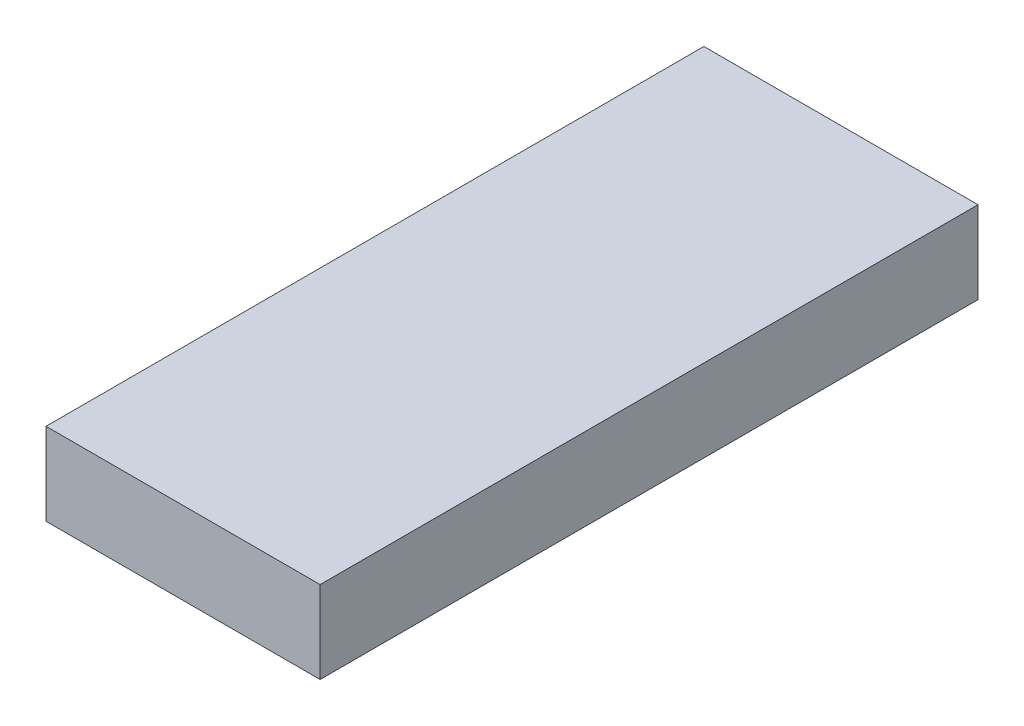
ISO-10303-21;
HEADER;
FILE_DESCRIPTION(('STEP AP214'),'2;1');
FILE_NAME('part.step','',(''),(''),'','','');
FILE_SCHEMA(('AUTOMOTIVE_DESIGN { 1 0 10303 214 1 1 1 1 }'));
ENDSEC;
DATA;
#1=APPLICATION_CONTEXT('core data for automotive mechanical design processes');
#2=APPLICATION_PROTOCOL_DEFINITION('international standard','automotive_design',2000,#1);
#3=PRODUCT_CONTEXT('',#1,'mechanical');
#4=PRODUCT('Part','Part','',(#3));
#5=PRODUCT_RELATED_PRODUCT_CATEGORY('part','',(#4));
#6=PRODUCT_DEFINITION_FORMATION('','',#4);
#7=PRODUCT_DEFINITION_CONTEXT('part definition',#1,'design');
#8=PRODUCT_DEFINITION('design','',#6,#7);
#9=PRODUCT_DEFINITION_SHAPE('','',#8);
#10=(LENGTH_UNIT() NAMED_UNIT(*) SI_UNIT(.MILLI.,.METRE.));
#11=(NAMED_UNIT(*) PLANE_ANGLE_UNIT() SI_UNIT($,.RADIAN.));
#12=(NAMED_UNIT(*) SI_UNIT($,.STERADIAN.) SOLID_ANGLE_UNIT());
#13=UNCERTAINTY_MEASURE_WITH_UNIT(LENGTH_MEASURE(1.E-05),#10,'distance_accuracy_value','');
#14=(GEOMETRIC_REPRESENTATION_CONTEXT(3) GLOBAL_UNCERTAINTY_ASSIGNED_CONTEXT((#13)) GLOBAL_UNIT_ASSIGNED_CONTEXT((#10,
#11,#12)) REPRESENTATION_CONTEXT('',''));
#15=CARTESIAN_POINT('',(0.,0.,0.));
#16=DIRECTION('',(0.,0.,1.));
#17=DIRECTION('',(1.,0.,0.));
#18=AXIS2_PLACEMENT_3D('',#15,#16,#17);
#19=CARTESIAN_POINT('',(25.,7.5,60.));
#20=DIRECTION('',(-1.,0.,0.));
#21=DIRECTION('',(0.,0.,1.));
#22=AXIS2_PLACEMENT_3D('',#19,#20,#21);
#23=PLANE('',#22);
#24=DIRECTION('',(0.,0.,-1.));
#25=VECTOR('',#24,1.);
#26=CARTESIAN_POINT('',(25.,-7.5,60.));
#27=LINE('',#26,#25);
#28=CARTESIAN_POINT('',(25.,-7.5,60.));
#29=VERTEX_POINT('',#28);
#30=CARTESIAN_POINT('',(25.,-7.5,-60.));
#31=VERTEX_POINT('',#30);
#32=EDGE_CURVE('E100',#29,#31,#27,.T.);
#33=ORIENTED_EDGE('',*,*,#32,.T.);
#34=DIRECTION('',(0.,-1.,0.));
#35=VECTOR('',#34,1.);
#36=CARTESIAN_POINT('',(25.,7.5,-60.));
#37=LINE('',#36,#35);
#38=CARTESIAN_POINT('',(25.,7.5,-60.));
#39=VERTEX_POINT('',#38);
#40=EDGE_CURVE('E11',#39,#31,#37,.T.);
#41=ORIENTED_EDGE('',*,*,#40,.F.);
#42=DIRECTION('',(0.,0.,-1.));
#43=VECTOR('',#42,1.);
#44=CARTESIAN_POINT('',(25.,7.5,60.));
#45=LINE('',#44,#43);
#46=CARTESIAN_POINT('',(25.,7.5,60.));
#47=VERTEX_POINT('',#46);
#48=EDGE_CURVE('E88',#47,#39,#45,.T.);
#49=ORIENTED_EDGE('',*,*,#48,.F.);
#50=DIRECTION('',(0.,-1.,0.));
#51=VECTOR('',#50,1.);
#52=CARTESIAN_POINT('',(25.,7.5,60.));
#53=LINE('',#52,#51);
#54=EDGE_CURVE('E96',#47,#29,#53,.T.);
#55=ORIENTED_EDGE('',*,*,#54,.T.);
#56=EDGE_LOOP('',(#33,#41,#49,#55));
#57=FACE_BOUND('',#56,.T.);
#58=ADVANCED_FACE('F37',(#57),#23,.F.);
#59=CARTESIAN_POINT('',(-25.,7.5,-60.));
#60=DIRECTION('',(0.,0.,1.));
#61=DIRECTION('',(1.,0.,0.));
#62=AXIS2_PLACEMENT_3D('',#59,#60,#61);
#63=PLANE('',#62);
#64=DIRECTION('',(-1.,0.,0.));
#65=VECTOR('',#64,1.);
#66=CARTESIAN_POINT('',(-25.,-7.5,-60.));
#67=LINE('',#66,#65);
#68=CARTESIAN_POINT('',(-25.,-7.5,-60.));
#69=VERTEX_POINT('',#68);
#70=EDGE_CURVE('E92',#31,#69,#67,.T.);
#71=ORIENTED_EDGE('',*,*,#70,.T.);
#72=DIRECTION('',(0.,-1.,0.));
#73=VECTOR('',#72,1.);
#74=CARTESIAN_POINT('',(-25.,7.5,-60.));
#75=LINE('',#74,#73);
#76=CARTESIAN_POINT('',(-25.,7.5,-60.));
#77=VERTEX_POINT('',#76);
#78=EDGE_CURVE('E45',#77,#69,#75,.T.);
#79=ORIENTED_EDGE('',*,*,#78,.F.);
#80=DIRECTION('',(-1.,0.,0.));
#81=VECTOR('',#80,1.);
#82=CARTESIAN_POINT('',(-25.,7.5,-60.));
#83=LINE('',#82,#81);
#84=EDGE_CURVE('E83',#39,#77,#83,.T.);
#85=ORIENTED_EDGE('',*,*,#84,.F.);
#86=ORIENTED_EDGE('',*,*,#40,.T.);
#87=EDGE_LOOP('',(#71,#79,#85,#86));
#88=FACE_BOUND('',#87,.T.);
#89=ADVANCED_FACE('F91',(#88),#63,.F.);
#90=CARTESIAN_POINT('',(-25.,7.5,60.));
#91=DIRECTION('',(1.,0.,0.));
#92=DIRECTION('',(0.,0.,-1.));
#93=AXIS2_PLACEMENT_3D('',#90,#91,#92);
#94=PLANE('',#93);
#95=DIRECTION('',(0.,0.,1.));
#96=VECTOR('',#95,1.);
#97=CARTESIAN_POINT('',(-25.,-7.5,60.));
#98=LINE('',#97,#96);
#99=CARTESIAN_POINT('',(-25.,-7.5,60.));
#100=VERTEX_POINT('',#99);
#101=EDGE_CURVE('E70',#69,#100,#98,.T.);
#102=ORIENTED_EDGE('',*,*,#101,.T.);
#103=DIRECTION('',(0.,-1.,0.));
#104=VECTOR('',#103,1.);
#105=CARTESIAN_POINT('',(-25.,7.5,60.));
#106=LINE('',#105,#104);
#107=CARTESIAN_POINT('',(-25.,7.5,60.));
#108=VERTEX_POINT('',#107);
#109=EDGE_CURVE('E93',#108,#100,#106,.T.);
#110=ORIENTED_EDGE('',*,*,#109,.F.);
#111=DIRECTION('',(0.,0.,1.));
#112=VECTOR('',#111,1.);
#113=CARTESIAN_POINT('',(-25.,7.5,60.));
#114=LINE('',#113,#112);
#115=EDGE_CURVE('E86',#77,#108,#114,.T.);
#116=ORIENTED_EDGE('',*,*,#115,.F.);
#117=ORIENTED_EDGE('',*,*,#78,.T.);
#118=EDGE_LOOP('',(#102,#110,#116,#117));
#119=FACE_BOUND('',#118,.T.);
#120=ADVANCED_FACE('F94',(#119),#94,.F.);
#121=CARTESIAN_POINT('',(-25.,7.5,60.));
#122=DIRECTION('',(0.,0.,-1.));
#123=DIRECTION('',(-1.,0.,0.));
#124=AXIS2_PLACEMENT_3D('',#121,#122,#123);
#125=PLANE('',#124);
#126=DIRECTION('',(1.,0.,0.));
#127=VECTOR('',#126,1.);
#128=CARTESIAN_POINT('',(-25.,-7.5,60.));
#129=LINE('',#128,#127);
#130=EDGE_CURVE('E76',#100,#29,#129,.T.);
#131=ORIENTED_EDGE('',*,*,#130,.T.);
#132=ORIENTED_EDGE('',*,*,#54,.F.);
#133=DIRECTION('',(1.,0.,0.));
#134=VECTOR('',#133,1.);
#135=CARTESIAN_POINT('',(-25.,7.5,60.));
#136=LINE('',#135,#134);
#137=EDGE_CURVE('E53',#108,#47,#136,.T.);
#138=ORIENTED_EDGE('',*,*,#137,.F.);
#139=ORIENTED_EDGE('',*,*,#109,.T.);
#140=EDGE_LOOP('',(#131,#132,#138,#139));
#141=FACE_BOUND('',#140,.T.);
#142=ADVANCED_FACE('F107',(#141),#125,.F.);
#143=CARTESIAN_POINT('',(0.,7.5,0.));
#144=DIRECTION('',(0.,-1.,0.));
#145=DIRECTION('',(0.,0.,-1.));
#146=AXIS2_PLACEMENT_3D('',#143,#144,#145);
#147=PLANE('',#146);
#148=ORIENTED_EDGE('',*,*,#48,.T.);
#149=ORIENTED_EDGE('',*,*,#84,.T.);
#150=ORIENTED_EDGE('',*,*,#115,.T.);
#151=ORIENTED_EDGE('',*,*,#137,.T.);
#152=EDGE_LOOP('',(#148,#149,#150,#151));
#153=FACE_BOUND('',#152,.T.);
#154=ADVANCED_FACE('F84',(#153),#147,.F.);
#155=CARTESIAN_POINT('',(0.,-7.5,0.));
#156=DIRECTION('',(0.,-1.,0.));
#157=DIRECTION('',(0.,0.,-1.));
#158=AXIS2_PLACEMENT_3D('',#155,#156,#157);
#159=PLANE('',#158);
#160=ORIENTED_EDGE('',*,*,#32,.F.);
#161=ORIENTED_EDGE('',*,*,#130,.F.);
#162=ORIENTED_EDGE('',*,*,#101,.F.);
#163=ORIENTED_EDGE('',*,*,#70,.F.);
#164=EDGE_LOOP('',(#160,#161,#162,#163));
#165=FACE_BOUND('',#164,.T.);
#166=ADVANCED_FACE('F110',(#165),#159,.T.);
#167=CLOSED_SHELL('',(#58,#89,#120,#142,#154,#166));
#168=MANIFOLD_SOLID_BREP('B2',#167);
#169=ADVANCED_BREP_SHAPE_REPRESENTATION('',(#18,#168),#14);
#170=SHAPE_DEFINITION_REPRESENTATION(#9,#169);
ENDSEC;
END-ISO-10303-21;
